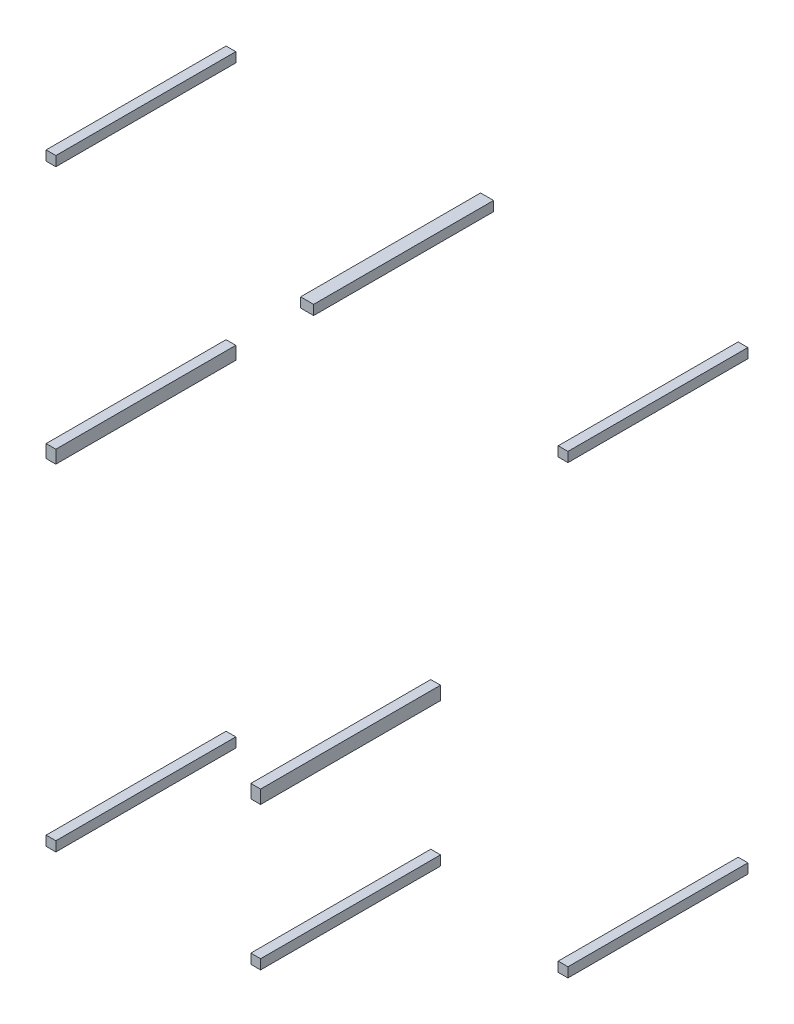
ISO-10303-21;
HEADER;
FILE_DESCRIPTION(('STEP AP214'),'2;1');
FILE_NAME('part.step','',(''),(''),'','','');
FILE_SCHEMA(('AUTOMOTIVE_DESIGN { 1 0 10303 214 1 1 1 1 }'));
ENDSEC;
DATA;
#1=APPLICATION_CONTEXT('core data for automotive mechanical design processes');
#2=APPLICATION_PROTOCOL_DEFINITION('international standard','automotive_design',2000,#1);
#3=PRODUCT_CONTEXT('',#1,'mechanical');
#4=PRODUCT('Part','Part','',(#3));
#5=PRODUCT_RELATED_PRODUCT_CATEGORY('part','',(#4));
#6=PRODUCT_DEFINITION_FORMATION('','',#4);
#7=PRODUCT_DEFINITION_CONTEXT('part definition',#1,'design');
#8=PRODUCT_DEFINITION('design','',#6,#7);
#9=PRODUCT_DEFINITION_SHAPE('','',#8);
#10=(LENGTH_UNIT() NAMED_UNIT(*) SI_UNIT(.MILLI.,.METRE.));
#11=(NAMED_UNIT(*) PLANE_ANGLE_UNIT() SI_UNIT($,.RADIAN.));
#12=(NAMED_UNIT(*) SI_UNIT($,.STERADIAN.) SOLID_ANGLE_UNIT());
#13=UNCERTAINTY_MEASURE_WITH_UNIT(LENGTH_MEASURE(1.E-05),#10,'distance_accuracy_value','');
#14=(GEOMETRIC_REPRESENTATION_CONTEXT(3) GLOBAL_UNCERTAINTY_ASSIGNED_CONTEXT((#13)) GLOBAL_UNIT_ASSIGNED_CONTEXT((#10,
#11,#12)) REPRESENTATION_CONTEXT('',''));
#15=CARTESIAN_POINT('',(0.,0.,0.));
#16=DIRECTION('',(0.,0.,1.));
#17=DIRECTION('',(1.,0.,0.));
#18=AXIS2_PLACEMENT_3D('',#15,#16,#17);
#19=CARTESIAN_POINT('',(0.,0.,0.));
#20=DIRECTION('',(0.,0.,1.));
#21=DIRECTION('',(1.,0.,0.));
#22=AXIS2_PLACEMENT_3D('',#19,#20,#21);
#23=PLANE('',#22);
#24=DIRECTION('',(0.,-1.,0.));
#25=VECTOR('',#24,1.);
#26=CARTESIAN_POINT('',(50.0000000000005,-3962.,0.));
#27=LINE('',#26,#25);
#28=CARTESIAN_POINT('',(50.0000000000005,-3962.,0.));
#29=VERTEX_POINT('',#28);
#30=CARTESIAN_POINT('',(50.0000000000005,-4162.,0.));
#31=VERTEX_POINT('',#30);
#32=EDGE_CURVE('E12',#29,#31,#27,.T.);
#33=ORIENTED_EDGE('',*,*,#32,.F.);
#34=DIRECTION('',(-1.,0.,0.));
#35=VECTOR('',#34,1.);
#36=CARTESIAN_POINT('',(50.0000000000005,-3962.,0.));
#37=LINE('',#36,#35);
#38=CARTESIAN_POINT('',(200.,-3962.,0.));
#39=VERTEX_POINT('',#38);
#40=EDGE_CURVE('E113',#39,#29,#37,.T.);
#41=ORIENTED_EDGE('',*,*,#40,.F.);
#42=DIRECTION('',(0.,1.,0.));
#43=VECTOR('',#42,1.);
#44=CARTESIAN_POINT('',(200.,-3962.,0.));
#45=LINE('',#44,#43);
#46=CARTESIAN_POINT('',(200.,-4162.,0.));
#47=VERTEX_POINT('',#46);
#48=EDGE_CURVE('E116',#47,#39,#45,.T.);
#49=ORIENTED_EDGE('',*,*,#48,.F.);
#50=DIRECTION('',(1.,0.,0.));
#51=VECTOR('',#50,1.);
#52=CARTESIAN_POINT('',(50.0000000000005,-4162.,0.));
#53=LINE('',#52,#51);
#54=EDGE_CURVE('E59',#31,#47,#53,.T.);
#55=ORIENTED_EDGE('',*,*,#54,.F.);
#56=EDGE_LOOP('',(#33,#41,#49,#55));
#57=FACE_BOUND('',#56,.T.);
#58=ADVANCED_FACE('F50',(#57),#23,.F.);
#59=CARTESIAN_POINT('',(50.0000000000005,-3962.,3022.8254304421));
#60=DIRECTION('',(0.,-1.,0.));
#61=DIRECTION('',(0.,0.,-1.));
#62=AXIS2_PLACEMENT_3D('',#59,#60,#61);
#63=PLANE('',#62);
#64=DIRECTION('',(0.,0.,-1.));
#65=VECTOR('',#64,1.);
#66=CARTESIAN_POINT('',(50.0000000000005,-3962.,3022.8254304421));
#67=LINE('',#66,#65);
#68=CARTESIAN_POINT('',(50.0000000000005,-3962.,2768.));
#69=VERTEX_POINT('',#68);
#70=EDGE_CURVE('E111',#69,#29,#67,.T.);
#71=ORIENTED_EDGE('',*,*,#70,.F.);
#72=DIRECTION('',(1.,0.,0.));
#73=VECTOR('',#72,1.);
#74=CARTESIAN_POINT('',(50.0000000000005,-3962.,2768.));
#75=LINE('',#74,#73);
#76=CARTESIAN_POINT('',(200.,-3962.,2768.));
#77=VERTEX_POINT('',#76);
#78=EDGE_CURVE('E104',#69,#77,#75,.T.);
#79=ORIENTED_EDGE('',*,*,#78,.T.);
#80=DIRECTION('',(0.,0.,-1.));
#81=VECTOR('',#80,1.);
#82=CARTESIAN_POINT('',(200.,-3962.,3022.8254304421));
#83=LINE('',#82,#81);
#84=EDGE_CURVE('E100',#77,#39,#83,.T.);
#85=ORIENTED_EDGE('',*,*,#84,.T.);
#86=ORIENTED_EDGE('',*,*,#40,.T.);
#87=EDGE_LOOP('',(#71,#79,#85,#86));
#88=FACE_BOUND('',#87,.T.);
#89=ADVANCED_FACE('F121',(#88),#63,.F.);
#90=CARTESIAN_POINT('',(200.,-3962.,3022.8254304421));
#91=DIRECTION('',(-1.,0.,0.));
#92=DIRECTION('',(0.,-1.,0.));
#93=AXIS2_PLACEMENT_3D('',#90,#91,#92);
#94=PLANE('',#93);
#95=ORIENTED_EDGE('',*,*,#84,.F.);
#96=DIRECTION('',(0.,-1.,0.));
#97=VECTOR('',#96,1.);
#98=CARTESIAN_POINT('',(200.,-3962.,2768.));
#99=LINE('',#98,#97);
#100=CARTESIAN_POINT('',(200.,-4162.,2768.));
#101=VERTEX_POINT('',#100);
#102=EDGE_CURVE('E54',#77,#101,#99,.T.);
#103=ORIENTED_EDGE('',*,*,#102,.T.);
#104=DIRECTION('',(0.,0.,-1.));
#105=VECTOR('',#104,1.);
#106=CARTESIAN_POINT('',(200.,-4162.,3022.8254304421));
#107=LINE('',#106,#105);
#108=EDGE_CURVE('E75',#101,#47,#107,.T.);
#109=ORIENTED_EDGE('',*,*,#108,.T.);
#110=ORIENTED_EDGE('',*,*,#48,.T.);
#111=EDGE_LOOP('',(#95,#103,#109,#110));
#112=FACE_BOUND('',#111,.T.);
#113=ADVANCED_FACE('F102',(#112),#94,.F.);
#114=CARTESIAN_POINT('',(50.0000000000005,-4162.,3022.8254304421));
#115=DIRECTION('',(0.,1.,0.));
#116=DIRECTION('',(0.,0.,1.));
#117=AXIS2_PLACEMENT_3D('',#114,#115,#116);
#118=PLANE('',#117);
#119=ORIENTED_EDGE('',*,*,#108,.F.);
#120=DIRECTION('',(-1.,0.,0.));
#121=VECTOR('',#120,1.);
#122=CARTESIAN_POINT('',(50.0000000000005,-4162.,2768.));
#123=LINE('',#122,#121);
#124=CARTESIAN_POINT('',(50.0000000000005,-4162.,2768.));
#125=VERTEX_POINT('',#124);
#126=EDGE_CURVE('E94',#101,#125,#123,.T.);
#127=ORIENTED_EDGE('',*,*,#126,.T.);
#128=DIRECTION('',(0.,0.,-1.));
#129=VECTOR('',#128,1.);
#130=CARTESIAN_POINT('',(50.0000000000005,-4162.,3022.8254304421));
#131=LINE('',#130,#129);
#132=EDGE_CURVE('E67',#125,#31,#131,.T.);
#133=ORIENTED_EDGE('',*,*,#132,.T.);
#134=ORIENTED_EDGE('',*,*,#54,.T.);
#135=EDGE_LOOP('',(#119,#127,#133,#134));
#136=FACE_BOUND('',#135,.T.);
#137=ADVANCED_FACE('F98',(#136),#118,.F.);
#138=CARTESIAN_POINT('',(50.0000000000005,-3962.,3022.8254304421));
#139=DIRECTION('',(1.,0.,0.));
#140=DIRECTION('',(0.,1.,0.));
#141=AXIS2_PLACEMENT_3D('',#138,#139,#140);
#142=PLANE('',#141);
#143=ORIENTED_EDGE('',*,*,#132,.F.);
#144=DIRECTION('',(0.,1.,0.));
#145=VECTOR('',#144,1.);
#146=CARTESIAN_POINT('',(50.0000000000005,-3962.,2768.));
#147=LINE('',#146,#145);
#148=EDGE_CURVE('E97',#125,#69,#147,.T.);
#149=ORIENTED_EDGE('',*,*,#148,.T.);
#150=ORIENTED_EDGE('',*,*,#70,.T.);
#151=ORIENTED_EDGE('',*,*,#32,.T.);
#152=EDGE_LOOP('',(#143,#149,#150,#151));
#153=FACE_BOUND('',#152,.T.);
#154=ADVANCED_FACE('F120',(#153),#142,.F.);
#155=CARTESIAN_POINT('',(0.,0.,2768.));
#156=DIRECTION('',(0.,0.,-1.));
#157=DIRECTION('',(0.,1.,0.));
#158=AXIS2_PLACEMENT_3D('',#155,#156,#157);
#159=PLANE('',#158);
#160=ORIENTED_EDGE('',*,*,#126,.F.);
#161=ORIENTED_EDGE('',*,*,#102,.F.);
#162=ORIENTED_EDGE('',*,*,#78,.F.);
#163=ORIENTED_EDGE('',*,*,#148,.F.);
#164=EDGE_LOOP('',(#160,#161,#162,#163));
#165=FACE_BOUND('',#164,.T.);
#166=ADVANCED_FACE('F52',(#165),#159,.F.);
#167=CLOSED_SHELL('',(#58,#89,#113,#137,#154,#166));
#168=MANIFOLD_SOLID_BREP('B2',#167);
#169=CARTESIAN_POINT('',(0.,0.,0.));
#170=DIRECTION('',(0.,0.,-1.));
#171=DIRECTION('',(-1.,0.,0.));
#172=AXIS2_PLACEMENT_3D('',#169,#170,#171);
#173=PLANE('',#172);
#174=DIRECTION('',(0.,1.,0.));
#175=VECTOR('',#174,1.);
#176=CARTESIAN_POINT('',(200.,-9178.,0.));
#177=LINE('',#176,#175);
#178=CARTESIAN_POINT('',(200.000000000001,-9328.,0.));
#179=VERTEX_POINT('',#178);
#180=CARTESIAN_POINT('',(200.,-9178.,0.));
#181=VERTEX_POINT('',#180);
#182=EDGE_CURVE('E48',#179,#181,#177,.T.);
#183=ORIENTED_EDGE('',*,*,#182,.F.);
#184=DIRECTION('',(1.,0.,0.));
#185=VECTOR('',#184,1.);
#186=CARTESIAN_POINT('',(200.000000000001,-9328.,0.));
#187=LINE('',#186,#185);
#188=CARTESIAN_POINT('',(50.0000000000005,-9328.,0.));
#189=VERTEX_POINT('',#188);
#190=EDGE_CURVE('E247',#189,#179,#187,.T.);
#191=ORIENTED_EDGE('',*,*,#190,.F.);
#192=DIRECTION('',(0.,-1.,0.));
#193=VECTOR('',#192,1.);
#194=CARTESIAN_POINT('',(50.0000000000005,-9178.,0.));
#195=LINE('',#194,#193);
#196=CARTESIAN_POINT('',(50.0000000000005,-9178.,0.));
#197=VERTEX_POINT('',#196);
#198=EDGE_CURVE('E250',#197,#189,#195,.T.);
#199=ORIENTED_EDGE('',*,*,#198,.F.);
#200=DIRECTION('',(-1.,0.,0.));
#201=VECTOR('',#200,1.);
#202=CARTESIAN_POINT('',(200.,-9178.,0.));
#203=LINE('',#202,#201);
#204=EDGE_CURVE('E193',#181,#197,#203,.T.);
#205=ORIENTED_EDGE('',*,*,#204,.F.);
#206=EDGE_LOOP('',(#183,#191,#199,#205));
#207=FACE_BOUND('',#206,.T.);
#208=ADVANCED_FACE('F184',(#207),#173,.T.);
#209=CARTESIAN_POINT('',(200.000000000001,-9328.,3022.8254304421));
#210=DIRECTION('',(0.,1.,0.));
#211=DIRECTION('',(0.,0.,1.));
#212=AXIS2_PLACEMENT_3D('',#209,#210,#211);
#213=PLANE('',#212);
#214=DIRECTION('',(0.,0.,-1.));
#215=VECTOR('',#214,1.);
#216=CARTESIAN_POINT('',(200.000000000001,-9328.,3022.8254304421));
#217=LINE('',#216,#215);
#218=CARTESIAN_POINT('',(200.000000000001,-9328.,2768.));
#219=VERTEX_POINT('',#218);
#220=EDGE_CURVE('E245',#219,#179,#217,.T.);
#221=ORIENTED_EDGE('',*,*,#220,.F.);
#222=DIRECTION('',(-1.,0.,0.));
#223=VECTOR('',#222,1.);
#224=CARTESIAN_POINT('',(200.000000000001,-9328.,2768.));
#225=LINE('',#224,#223);
#226=CARTESIAN_POINT('',(50.0000000000005,-9328.,2768.));
#227=VERTEX_POINT('',#226);
#228=EDGE_CURVE('E238',#219,#227,#225,.T.);
#229=ORIENTED_EDGE('',*,*,#228,.T.);
#230=DIRECTION('',(0.,0.,-1.));
#231=VECTOR('',#230,1.);
#232=CARTESIAN_POINT('',(50.0000000000005,-9328.,3022.8254304421));
#233=LINE('',#232,#231);
#234=EDGE_CURVE('E234',#227,#189,#233,.T.);
#235=ORIENTED_EDGE('',*,*,#234,.T.);
#236=ORIENTED_EDGE('',*,*,#190,.T.);
#237=EDGE_LOOP('',(#221,#229,#235,#236));
#238=FACE_BOUND('',#237,.T.);
#239=ADVANCED_FACE('F255',(#238),#213,.F.);
#240=CARTESIAN_POINT('',(50.0000000000005,-9178.,3022.8254304421));
#241=DIRECTION('',(1.,0.,0.));
#242=DIRECTION('',(0.,1.,0.));
#243=AXIS2_PLACEMENT_3D('',#240,#241,#242);
#244=PLANE('',#243);
#245=ORIENTED_EDGE('',*,*,#234,.F.);
#246=DIRECTION('',(0.,1.,0.));
#247=VECTOR('',#246,1.);
#248=CARTESIAN_POINT('',(50.0000000000005,-9178.,2768.));
#249=LINE('',#248,#247);
#250=CARTESIAN_POINT('',(50.0000000000005,-9178.,2768.));
#251=VERTEX_POINT('',#250);
#252=EDGE_CURVE('E188',#227,#251,#249,.T.);
#253=ORIENTED_EDGE('',*,*,#252,.T.);
#254=DIRECTION('',(0.,0.,-1.));
#255=VECTOR('',#254,1.);
#256=CARTESIAN_POINT('',(50.0000000000005,-9178.,3022.8254304421));
#257=LINE('',#256,#255);
#258=EDGE_CURVE('E209',#251,#197,#257,.T.);
#259=ORIENTED_EDGE('',*,*,#258,.T.);
#260=ORIENTED_EDGE('',*,*,#198,.T.);
#261=EDGE_LOOP('',(#245,#253,#259,#260));
#262=FACE_BOUND('',#261,.T.);
#263=ADVANCED_FACE('F236',(#262),#244,.F.);
#264=CARTESIAN_POINT('',(200.,-9178.,3022.8254304421));
#265=DIRECTION('',(0.,-1.,0.));
#266=DIRECTION('',(0.,0.,-1.));
#267=AXIS2_PLACEMENT_3D('',#264,#265,#266);
#268=PLANE('',#267);
#269=ORIENTED_EDGE('',*,*,#258,.F.);
#270=DIRECTION('',(1.,0.,0.));
#271=VECTOR('',#270,1.);
#272=CARTESIAN_POINT('',(200.,-9178.,2768.));
#273=LINE('',#272,#271);
#274=CARTESIAN_POINT('',(200.,-9178.,2768.));
#275=VERTEX_POINT('',#274);
#276=EDGE_CURVE('E228',#251,#275,#273,.T.);
#277=ORIENTED_EDGE('',*,*,#276,.T.);
#278=DIRECTION('',(0.,0.,-1.));
#279=VECTOR('',#278,1.);
#280=CARTESIAN_POINT('',(200.,-9178.,3022.8254304421));
#281=LINE('',#280,#279);
#282=EDGE_CURVE('E201',#275,#181,#281,.T.);
#283=ORIENTED_EDGE('',*,*,#282,.T.);
#284=ORIENTED_EDGE('',*,*,#204,.T.);
#285=EDGE_LOOP('',(#269,#277,#283,#284));
#286=FACE_BOUND('',#285,.T.);
#287=ADVANCED_FACE('F232',(#286),#268,.F.);
#288=CARTESIAN_POINT('',(200.,-9178.,3022.8254304421));
#289=DIRECTION('',(-1.,0.,0.));
#290=DIRECTION('',(0.,-1.,0.));
#291=AXIS2_PLACEMENT_3D('',#288,#289,#290);
#292=PLANE('',#291);
#293=ORIENTED_EDGE('',*,*,#282,.F.);
#294=DIRECTION('',(0.,-1.,0.));
#295=VECTOR('',#294,1.);
#296=CARTESIAN_POINT('',(200.,-9178.,2768.));
#297=LINE('',#296,#295);
#298=EDGE_CURVE('E231',#275,#219,#297,.T.);
#299=ORIENTED_EDGE('',*,*,#298,.T.);
#300=ORIENTED_EDGE('',*,*,#220,.T.);
#301=ORIENTED_EDGE('',*,*,#182,.T.);
#302=EDGE_LOOP('',(#293,#299,#300,#301));
#303=FACE_BOUND('',#302,.T.);
#304=ADVANCED_FACE('F254',(#303),#292,.F.);
#305=CARTESIAN_POINT('',(0.,0.,2768.));
#306=DIRECTION('',(0.,0.,-1.));
#307=DIRECTION('',(0.,1.,0.));
#308=AXIS2_PLACEMENT_3D('',#305,#306,#307);
#309=PLANE('',#308);
#310=ORIENTED_EDGE('',*,*,#276,.F.);
#311=ORIENTED_EDGE('',*,*,#252,.F.);
#312=ORIENTED_EDGE('',*,*,#228,.F.);
#313=ORIENTED_EDGE('',*,*,#298,.F.);
#314=EDGE_LOOP('',(#310,#311,#312,#313));
#315=FACE_BOUND('',#314,.T.);
#316=ADVANCED_FACE('F186',(#315),#309,.F.);
#317=CLOSED_SHELL('',(#208,#239,#263,#287,#304,#316));
#318=MANIFOLD_SOLID_BREP('B6',#317);
#319=CARTESIAN_POINT('',(0.,0.,0.));
#320=DIRECTION('',(0.,0.,1.));
#321=DIRECTION('',(1.,0.,0.));
#322=AXIS2_PLACEMENT_3D('',#319,#320,#321);
#323=PLANE('',#322);
#324=DIRECTION('',(0.,-1.,0.));
#325=VECTOR('',#324,1.);
#326=CARTESIAN_POINT('',(7927.,-6917.99999999999,0.));
#327=LINE('',#326,#325);
#328=CARTESIAN_POINT('',(7927.,-6917.99999999999,0.));
#329=VERTEX_POINT('',#328);
#330=CARTESIAN_POINT('',(7927.,-7067.99999999999,0.));
#331=VERTEX_POINT('',#330);
#332=EDGE_CURVE('E182',#329,#331,#327,.T.);
#333=ORIENTED_EDGE('',*,*,#332,.F.);
#334=DIRECTION('',(-1.,0.,0.));
#335=VECTOR('',#334,1.);
#336=CARTESIAN_POINT('',(7927.,-6917.99999999999,0.));
#337=LINE('',#336,#335);
#338=CARTESIAN_POINT('',(8077.,-6917.99999999999,0.));
#339=VERTEX_POINT('',#338);
#340=EDGE_CURVE('E381',#339,#329,#337,.T.);
#341=ORIENTED_EDGE('',*,*,#340,.F.);
#342=DIRECTION('',(0.,1.,0.));
#343=VECTOR('',#342,1.);
#344=CARTESIAN_POINT('',(8077.,-6917.99999999999,0.));
#345=LINE('',#344,#343);
#346=CARTESIAN_POINT('',(8077.,-7067.99999999999,0.));
#347=VERTEX_POINT('',#346);
#348=EDGE_CURVE('E384',#347,#339,#345,.T.);
#349=ORIENTED_EDGE('',*,*,#348,.F.);
#350=DIRECTION('',(1.,0.,0.));
#351=VECTOR('',#350,1.);
#352=CARTESIAN_POINT('',(7927.,-7067.99999999999,0.));
#353=LINE('',#352,#351);
#354=EDGE_CURVE('E327',#331,#347,#353,.T.);
#355=ORIENTED_EDGE('',*,*,#354,.F.);
#356=EDGE_LOOP('',(#333,#341,#349,#355));
#357=FACE_BOUND('',#356,.T.);
#358=ADVANCED_FACE('F318',(#357),#323,.F.);
#359=CARTESIAN_POINT('',(7927.,-6917.99999999999,3022.8254304421));
#360=DIRECTION('',(0.,-1.,0.));
#361=DIRECTION('',(0.,0.,-1.));
#362=AXIS2_PLACEMENT_3D('',#359,#360,#361);
#363=PLANE('',#362);
#364=DIRECTION('',(0.,0.,-1.));
#365=VECTOR('',#364,1.);
#366=CARTESIAN_POINT('',(7927.,-6917.99999999999,3022.8254304421));
#367=LINE('',#366,#365);
#368=CARTESIAN_POINT('',(7927.,-6917.99999999999,2768.));
#369=VERTEX_POINT('',#368);
#370=EDGE_CURVE('E379',#369,#329,#367,.T.);
#371=ORIENTED_EDGE('',*,*,#370,.F.);
#372=DIRECTION('',(1.,0.,0.));
#373=VECTOR('',#372,1.);
#374=CARTESIAN_POINT('',(7927.,-6917.99999999999,2768.));
#375=LINE('',#374,#373);
#376=CARTESIAN_POINT('',(8077.,-6917.99999999999,2768.));
#377=VERTEX_POINT('',#376);
#378=EDGE_CURVE('E372',#369,#377,#375,.T.);
#379=ORIENTED_EDGE('',*,*,#378,.T.);
#380=DIRECTION('',(0.,0.,-1.));
#381=VECTOR('',#380,1.);
#382=CARTESIAN_POINT('',(8077.,-6917.99999999999,3022.8254304421));
#383=LINE('',#382,#381);
#384=EDGE_CURVE('E368',#377,#339,#383,.T.);
#385=ORIENTED_EDGE('',*,*,#384,.T.);
#386=ORIENTED_EDGE('',*,*,#340,.T.);
#387=EDGE_LOOP('',(#371,#379,#385,#386));
#388=FACE_BOUND('',#387,.T.);
#389=ADVANCED_FACE('F389',(#388),#363,.F.);
#390=CARTESIAN_POINT('',(8077.,-6917.99999999999,3022.8254304421));
#391=DIRECTION('',(-1.,0.,0.));
#392=DIRECTION('',(0.,-1.,0.));
#393=AXIS2_PLACEMENT_3D('',#390,#391,#392);
#394=PLANE('',#393);
#395=ORIENTED_EDGE('',*,*,#384,.F.);
#396=DIRECTION('',(0.,-1.,0.));
#397=VECTOR('',#396,1.);
#398=CARTESIAN_POINT('',(8077.,-6917.99999999999,2768.));
#399=LINE('',#398,#397);
#400=CARTESIAN_POINT('',(8077.,-7067.99999999999,2768.));
#401=VERTEX_POINT('',#400);
#402=EDGE_CURVE('E322',#377,#401,#399,.T.);
#403=ORIENTED_EDGE('',*,*,#402,.T.);
#404=DIRECTION('',(0.,0.,-1.));
#405=VECTOR('',#404,1.);
#406=CARTESIAN_POINT('',(8077.,-7067.99999999999,3022.8254304421));
#407=LINE('',#406,#405);
#408=EDGE_CURVE('E343',#401,#347,#407,.T.);
#409=ORIENTED_EDGE('',*,*,#408,.T.);
#410=ORIENTED_EDGE('',*,*,#348,.T.);
#411=EDGE_LOOP('',(#395,#403,#409,#410));
#412=FACE_BOUND('',#411,.T.);
#413=ADVANCED_FACE('F370',(#412),#394,.F.);
#414=CARTESIAN_POINT('',(7927.,-7067.99999999999,3022.8254304421));
#415=DIRECTION('',(0.,1.,0.));
#416=DIRECTION('',(0.,0.,1.));
#417=AXIS2_PLACEMENT_3D('',#414,#415,#416);
#418=PLANE('',#417);
#419=ORIENTED_EDGE('',*,*,#408,.F.);
#420=DIRECTION('',(-1.,0.,0.));
#421=VECTOR('',#420,1.);
#422=CARTESIAN_POINT('',(7927.,-7067.99999999999,2768.));
#423=LINE('',#422,#421);
#424=CARTESIAN_POINT('',(7927.,-7067.99999999999,2768.));
#425=VERTEX_POINT('',#424);
#426=EDGE_CURVE('E362',#401,#425,#423,.T.);
#427=ORIENTED_EDGE('',*,*,#426,.T.);
#428=DIRECTION('',(0.,0.,-1.));
#429=VECTOR('',#428,1.);
#430=CARTESIAN_POINT('',(7927.,-7067.99999999999,3022.8254304421));
#431=LINE('',#430,#429);
#432=EDGE_CURVE('E335',#425,#331,#431,.T.);
#433=ORIENTED_EDGE('',*,*,#432,.T.);
#434=ORIENTED_EDGE('',*,*,#354,.T.);
#435=EDGE_LOOP('',(#419,#427,#433,#434));
#436=FACE_BOUND('',#435,.T.);
#437=ADVANCED_FACE('F366',(#436),#418,.F.);
#438=CARTESIAN_POINT('',(7927.,-6917.99999999999,3022.8254304421));
#439=DIRECTION('',(1.,0.,0.));
#440=DIRECTION('',(0.,1.,0.));
#441=AXIS2_PLACEMENT_3D('',#438,#439,#440);
#442=PLANE('',#441);
#443=ORIENTED_EDGE('',*,*,#432,.F.);
#444=DIRECTION('',(0.,1.,0.));
#445=VECTOR('',#444,1.);
#446=CARTESIAN_POINT('',(7927.,-6917.99999999999,2768.));
#447=LINE('',#446,#445);
#448=EDGE_CURVE('E365',#425,#369,#447,.T.);
#449=ORIENTED_EDGE('',*,*,#448,.T.);
#450=ORIENTED_EDGE('',*,*,#370,.T.);
#451=ORIENTED_EDGE('',*,*,#332,.T.);
#452=EDGE_LOOP('',(#443,#449,#450,#451));
#453=FACE_BOUND('',#452,.T.);
#454=ADVANCED_FACE('F388',(#453),#442,.F.);
#455=CARTESIAN_POINT('',(0.,0.,2768.));
#456=DIRECTION('',(0.,0.,-1.));
#457=DIRECTION('',(0.,1.,0.));
#458=AXIS2_PLACEMENT_3D('',#455,#456,#457);
#459=PLANE('',#458);
#460=ORIENTED_EDGE('',*,*,#426,.F.);
#461=ORIENTED_EDGE('',*,*,#402,.F.);
#462=ORIENTED_EDGE('',*,*,#378,.F.);
#463=ORIENTED_EDGE('',*,*,#448,.F.);
#464=EDGE_LOOP('',(#460,#461,#462,#463));
#465=FACE_BOUND('',#464,.T.);
#466=ADVANCED_FACE('F320',(#465),#459,.F.);
#467=CLOSED_SHELL('',(#358,#389,#413,#437,#454,#466));
#468=MANIFOLD_SOLID_BREP('B42',#467);
#469=CARTESIAN_POINT('',(0.,0.,0.));
#470=DIRECTION('',(0.,0.,1.));
#471=DIRECTION('',(1.,0.,0.));
#472=AXIS2_PLACEMENT_3D('',#469,#470,#471);
#473=PLANE('',#472);
#474=DIRECTION('',(0.,-1.,0.));
#475=VECTOR('',#474,1.);
#476=CARTESIAN_POINT('',(3199.,-9175.,0.));
#477=LINE('',#476,#475);
#478=CARTESIAN_POINT('',(3199.,-9175.,0.));
#479=VERTEX_POINT('',#478);
#480=CARTESIAN_POINT('',(3199.,-9325.,0.));
#481=VERTEX_POINT('',#480);
#482=EDGE_CURVE('E316',#479,#481,#477,.T.);
#483=ORIENTED_EDGE('',*,*,#482,.F.);
#484=DIRECTION('',(-1.,0.,0.));
#485=VECTOR('',#484,1.);
#486=CARTESIAN_POINT('',(3199.,-9175.,0.));
#487=LINE('',#486,#485);
#488=CARTESIAN_POINT('',(3349.,-9175.,0.));
#489=VERTEX_POINT('',#488);
#490=EDGE_CURVE('E515',#489,#479,#487,.T.);
#491=ORIENTED_EDGE('',*,*,#490,.F.);
#492=DIRECTION('',(0.,1.,0.));
#493=VECTOR('',#492,1.);
#494=CARTESIAN_POINT('',(3349.,-9175.,0.));
#495=LINE('',#494,#493);
#496=CARTESIAN_POINT('',(3349.,-9325.,0.));
#497=VERTEX_POINT('',#496);
#498=EDGE_CURVE('E518',#497,#489,#495,.T.);
#499=ORIENTED_EDGE('',*,*,#498,.F.);
#500=DIRECTION('',(1.,0.,0.));
#501=VECTOR('',#500,1.);
#502=CARTESIAN_POINT('',(3199.,-9325.,0.));
#503=LINE('',#502,#501);
#504=EDGE_CURVE('E461',#481,#497,#503,.T.);
#505=ORIENTED_EDGE('',*,*,#504,.F.);
#506=EDGE_LOOP('',(#483,#491,#499,#505));
#507=FACE_BOUND('',#506,.T.);
#508=ADVANCED_FACE('F452',(#507),#473,.F.);
#509=CARTESIAN_POINT('',(3199.,-9175.,3022.8254304421));
#510=DIRECTION('',(0.,-1.,0.));
#511=DIRECTION('',(0.,0.,-1.));
#512=AXIS2_PLACEMENT_3D('',#509,#510,#511);
#513=PLANE('',#512);
#514=DIRECTION('',(0.,0.,-1.));
#515=VECTOR('',#514,1.);
#516=CARTESIAN_POINT('',(3199.,-9175.,3022.8254304421));
#517=LINE('',#516,#515);
#518=CARTESIAN_POINT('',(3199.,-9175.,2768.));
#519=VERTEX_POINT('',#518);
#520=EDGE_CURVE('E513',#519,#479,#517,.T.);
#521=ORIENTED_EDGE('',*,*,#520,.F.);
#522=DIRECTION('',(1.,0.,0.));
#523=VECTOR('',#522,1.);
#524=CARTESIAN_POINT('',(3199.,-9175.,2768.));
#525=LINE('',#524,#523);
#526=CARTESIAN_POINT('',(3349.,-9175.,2768.));
#527=VERTEX_POINT('',#526);
#528=EDGE_CURVE('E506',#519,#527,#525,.T.);
#529=ORIENTED_EDGE('',*,*,#528,.T.);
#530=DIRECTION('',(0.,0.,-1.));
#531=VECTOR('',#530,1.);
#532=CARTESIAN_POINT('',(3349.,-9175.,3022.8254304421));
#533=LINE('',#532,#531);
#534=EDGE_CURVE('E502',#527,#489,#533,.T.);
#535=ORIENTED_EDGE('',*,*,#534,.T.);
#536=ORIENTED_EDGE('',*,*,#490,.T.);
#537=EDGE_LOOP('',(#521,#529,#535,#536));
#538=FACE_BOUND('',#537,.T.);
#539=ADVANCED_FACE('F523',(#538),#513,.F.);
#540=CARTESIAN_POINT('',(3349.,-9175.,3022.8254304421));
#541=DIRECTION('',(-1.,0.,0.));
#542=DIRECTION('',(0.,0.,1.));
#543=AXIS2_PLACEMENT_3D('',#540,#541,#542);
#544=PLANE('',#543);
#545=ORIENTED_EDGE('',*,*,#534,.F.);
#546=DIRECTION('',(0.,-1.,0.));
#547=VECTOR('',#546,1.);
#548=CARTESIAN_POINT('',(3349.,-9175.,2768.));
#549=LINE('',#548,#547);
#550=CARTESIAN_POINT('',(3349.,-9325.,2768.));
#551=VERTEX_POINT('',#550);
#552=EDGE_CURVE('E456',#527,#551,#549,.T.);
#553=ORIENTED_EDGE('',*,*,#552,.T.);
#554=DIRECTION('',(0.,0.,-1.));
#555=VECTOR('',#554,1.);
#556=CARTESIAN_POINT('',(3349.,-9325.,3022.8254304421));
#557=LINE('',#556,#555);
#558=EDGE_CURVE('E477',#551,#497,#557,.T.);
#559=ORIENTED_EDGE('',*,*,#558,.T.);
#560=ORIENTED_EDGE('',*,*,#498,.T.);
#561=EDGE_LOOP('',(#545,#553,#559,#560));
#562=FACE_BOUND('',#561,.T.);
#563=ADVANCED_FACE('F504',(#562),#544,.F.);
#564=CARTESIAN_POINT('',(3199.,-9325.,3022.8254304421));
#565=DIRECTION('',(0.,1.,0.));
#566=DIRECTION('',(0.,0.,1.));
#567=AXIS2_PLACEMENT_3D('',#564,#565,#566);
#568=PLANE('',#567);
#569=ORIENTED_EDGE('',*,*,#558,.F.);
#570=DIRECTION('',(-1.,0.,0.));
#571=VECTOR('',#570,1.);
#572=CARTESIAN_POINT('',(3199.,-9325.,2768.));
#573=LINE('',#572,#571);
#574=CARTESIAN_POINT('',(3199.,-9325.,2768.));
#575=VERTEX_POINT('',#574);
#576=EDGE_CURVE('E496',#551,#575,#573,.T.);
#577=ORIENTED_EDGE('',*,*,#576,.T.);
#578=DIRECTION('',(0.,0.,-1.));
#579=VECTOR('',#578,1.);
#580=CARTESIAN_POINT('',(3199.,-9325.,3022.8254304421));
#581=LINE('',#580,#579);
#582=EDGE_CURVE('E469',#575,#481,#581,.T.);
#583=ORIENTED_EDGE('',*,*,#582,.T.);
#584=ORIENTED_EDGE('',*,*,#504,.T.);
#585=EDGE_LOOP('',(#569,#577,#583,#584));
#586=FACE_BOUND('',#585,.T.);
#587=ADVANCED_FACE('F500',(#586),#568,.F.);
#588=CARTESIAN_POINT('',(3199.,-9175.,3022.8254304421));
#589=DIRECTION('',(1.,0.,0.));
#590=DIRECTION('',(0.,0.,-1.));
#591=AXIS2_PLACEMENT_3D('',#588,#589,#590);
#592=PLANE('',#591);
#593=ORIENTED_EDGE('',*,*,#582,.F.);
#594=DIRECTION('',(0.,1.,0.));
#595=VECTOR('',#594,1.);
#596=CARTESIAN_POINT('',(3199.,-9175.,2768.));
#597=LINE('',#596,#595);
#598=EDGE_CURVE('E499',#575,#519,#597,.T.);
#599=ORIENTED_EDGE('',*,*,#598,.T.);
#600=ORIENTED_EDGE('',*,*,#520,.T.);
#601=ORIENTED_EDGE('',*,*,#482,.T.);
#602=EDGE_LOOP('',(#593,#599,#600,#601));
#603=FACE_BOUND('',#602,.T.);
#604=ADVANCED_FACE('F522',(#603),#592,.F.);
#605=CARTESIAN_POINT('',(0.,0.,2768.));
#606=DIRECTION('',(0.,0.,-1.));
#607=DIRECTION('',(0.,1.,0.));
#608=AXIS2_PLACEMENT_3D('',#605,#606,#607);
#609=PLANE('',#608);
#610=ORIENTED_EDGE('',*,*,#576,.F.);
#611=ORIENTED_EDGE('',*,*,#552,.F.);
#612=ORIENTED_EDGE('',*,*,#528,.F.);
#613=ORIENTED_EDGE('',*,*,#598,.F.);
#614=EDGE_LOOP('',(#610,#611,#612,#613));
#615=FACE_BOUND('',#614,.T.);
#616=ADVANCED_FACE('F454',(#615),#609,.F.);
#617=CLOSED_SHELL('',(#508,#539,#563,#587,#604,#616));
#618=MANIFOLD_SOLID_BREP('B176',#617);
#619=CARTESIAN_POINT('',(0.,0.,0.));
#620=DIRECTION('',(0.,0.,1.));
#621=DIRECTION('',(1.,0.,0.));
#622=AXIS2_PLACEMENT_3D('',#619,#620,#621);
#623=PLANE('',#622);
#624=DIRECTION('',(0.,-1.,0.));
#625=VECTOR('',#624,1.);
#626=CARTESIAN_POINT('',(3199.,-6914.99999999999,0.));
#627=LINE('',#626,#625);
#628=CARTESIAN_POINT('',(3199.,-6914.99999999999,0.));
#629=VERTEX_POINT('',#628);
#630=CARTESIAN_POINT('',(3199.,-7120.99999999999,0.));
#631=VERTEX_POINT('',#630);
#632=EDGE_CURVE('E450',#629,#631,#627,.T.);
#633=ORIENTED_EDGE('',*,*,#632,.F.);
#634=DIRECTION('',(-1.,0.,0.));
#635=VECTOR('',#634,1.);
#636=CARTESIAN_POINT('',(3199.,-6914.99999999999,0.));
#637=LINE('',#636,#635);
#638=CARTESIAN_POINT('',(3349.,-6914.99999999999,0.));
#639=VERTEX_POINT('',#638);
#640=EDGE_CURVE('E649',#639,#629,#637,.T.);
#641=ORIENTED_EDGE('',*,*,#640,.F.);
#642=DIRECTION('',(0.,1.,0.));
#643=VECTOR('',#642,1.);
#644=CARTESIAN_POINT('',(3349.,-6914.99999999999,0.));
#645=LINE('',#644,#643);
#646=CARTESIAN_POINT('',(3349.,-7120.99999999999,0.));
#647=VERTEX_POINT('',#646);
#648=EDGE_CURVE('E652',#647,#639,#645,.T.);
#649=ORIENTED_EDGE('',*,*,#648,.F.);
#650=DIRECTION('',(1.,0.,0.));
#651=VECTOR('',#650,1.);
#652=CARTESIAN_POINT('',(3199.,-7120.99999999999,0.));
#653=LINE('',#652,#651);
#654=EDGE_CURVE('E595',#631,#647,#653,.T.);
#655=ORIENTED_EDGE('',*,*,#654,.F.);
#656=EDGE_LOOP('',(#633,#641,#649,#655));
#657=FACE_BOUND('',#656,.T.);
#658=ADVANCED_FACE('F586',(#657),#623,.F.);
#659=CARTESIAN_POINT('',(3199.,-6914.99999999999,3022.8254304421));
#660=DIRECTION('',(0.,-1.,0.));
#661=DIRECTION('',(0.,0.,-1.));
#662=AXIS2_PLACEMENT_3D('',#659,#660,#661);
#663=PLANE('',#662);
#664=DIRECTION('',(0.,0.,-1.));
#665=VECTOR('',#664,1.);
#666=CARTESIAN_POINT('',(3199.,-6914.99999999999,3022.8254304421));
#667=LINE('',#666,#665);
#668=CARTESIAN_POINT('',(3199.,-6914.99999999999,2768.));
#669=VERTEX_POINT('',#668);
#670=EDGE_CURVE('E647',#669,#629,#667,.T.);
#671=ORIENTED_EDGE('',*,*,#670,.F.);
#672=DIRECTION('',(1.,0.,0.));
#673=VECTOR('',#672,1.);
#674=CARTESIAN_POINT('',(3199.,-6914.99999999999,2768.));
#675=LINE('',#674,#673);
#676=CARTESIAN_POINT('',(3349.,-6914.99999999999,2768.));
#677=VERTEX_POINT('',#676);
#678=EDGE_CURVE('E640',#669,#677,#675,.T.);
#679=ORIENTED_EDGE('',*,*,#678,.T.);
#680=DIRECTION('',(0.,0.,-1.));
#681=VECTOR('',#680,1.);
#682=CARTESIAN_POINT('',(3349.,-6914.99999999999,3022.8254304421));
#683=LINE('',#682,#681);
#684=EDGE_CURVE('E636',#677,#639,#683,.T.);
#685=ORIENTED_EDGE('',*,*,#684,.T.);
#686=ORIENTED_EDGE('',*,*,#640,.T.);
#687=EDGE_LOOP('',(#671,#679,#685,#686));
#688=FACE_BOUND('',#687,.T.);
#689=ADVANCED_FACE('F657',(#688),#663,.F.);
#690=CARTESIAN_POINT('',(3349.,-6914.99999999999,3022.8254304421));
#691=DIRECTION('',(-1.,0.,0.));
#692=DIRECTION('',(0.,0.,1.));
#693=AXIS2_PLACEMENT_3D('',#690,#691,#692);
#694=PLANE('',#693);
#695=ORIENTED_EDGE('',*,*,#684,.F.);
#696=DIRECTION('',(0.,-1.,0.));
#697=VECTOR('',#696,1.);
#698=CARTESIAN_POINT('',(3349.,-6914.99999999999,2768.));
#699=LINE('',#698,#697);
#700=CARTESIAN_POINT('',(3349.,-7120.99999999999,2768.));
#701=VERTEX_POINT('',#700);
#702=EDGE_CURVE('E590',#677,#701,#699,.T.);
#703=ORIENTED_EDGE('',*,*,#702,.T.);
#704=DIRECTION('',(0.,0.,-1.));
#705=VECTOR('',#704,1.);
#706=CARTESIAN_POINT('',(3349.,-7120.99999999999,3022.8254304421));
#707=LINE('',#706,#705);
#708=EDGE_CURVE('E611',#701,#647,#707,.T.);
#709=ORIENTED_EDGE('',*,*,#708,.T.);
#710=ORIENTED_EDGE('',*,*,#648,.T.);
#711=EDGE_LOOP('',(#695,#703,#709,#710));
#712=FACE_BOUND('',#711,.T.);
#713=ADVANCED_FACE('F638',(#712),#694,.F.);
#714=CARTESIAN_POINT('',(3199.,-7120.99999999999,3022.8254304421));
#715=DIRECTION('',(0.,1.,0.));
#716=DIRECTION('',(0.,0.,1.));
#717=AXIS2_PLACEMENT_3D('',#714,#715,#716);
#718=PLANE('',#717);
#719=ORIENTED_EDGE('',*,*,#708,.F.);
#720=DIRECTION('',(-1.,0.,0.));
#721=VECTOR('',#720,1.);
#722=CARTESIAN_POINT('',(3199.,-7120.99999999999,2768.));
#723=LINE('',#722,#721);
#724=CARTESIAN_POINT('',(3199.,-7120.99999999999,2768.));
#725=VERTEX_POINT('',#724);
#726=EDGE_CURVE('E630',#701,#725,#723,.T.);
#727=ORIENTED_EDGE('',*,*,#726,.T.);
#728=DIRECTION('',(0.,0.,-1.));
#729=VECTOR('',#728,1.);
#730=CARTESIAN_POINT('',(3199.,-7120.99999999999,3022.8254304421));
#731=LINE('',#730,#729);
#732=EDGE_CURVE('E603',#725,#631,#731,.T.);
#733=ORIENTED_EDGE('',*,*,#732,.T.);
#734=ORIENTED_EDGE('',*,*,#654,.T.);
#735=EDGE_LOOP('',(#719,#727,#733,#734));
#736=FACE_BOUND('',#735,.T.);
#737=ADVANCED_FACE('F634',(#736),#718,.F.);
#738=CARTESIAN_POINT('',(3199.,-6914.99999999999,3022.8254304421));
#739=DIRECTION('',(1.,0.,0.));
#740=DIRECTION('',(0.,0.,-1.));
#741=AXIS2_PLACEMENT_3D('',#738,#739,#740);
#742=PLANE('',#741);
#743=ORIENTED_EDGE('',*,*,#732,.F.);
#744=DIRECTION('',(0.,1.,0.));
#745=VECTOR('',#744,1.);
#746=CARTESIAN_POINT('',(3199.,-6914.99999999999,2768.));
#747=LINE('',#746,#745);
#748=EDGE_CURVE('E633',#725,#669,#747,.T.);
#749=ORIENTED_EDGE('',*,*,#748,.T.);
#750=ORIENTED_EDGE('',*,*,#670,.T.);
#751=ORIENTED_EDGE('',*,*,#632,.T.);
#752=EDGE_LOOP('',(#743,#749,#750,#751));
#753=FACE_BOUND('',#752,.T.);
#754=ADVANCED_FACE('F656',(#753),#742,.F.);
#755=CARTESIAN_POINT('',(0.,0.,2768.));
#756=DIRECTION('',(0.,0.,-1.));
#757=DIRECTION('',(0.,1.,0.));
#758=AXIS2_PLACEMENT_3D('',#755,#756,#757);
#759=PLANE('',#758);
#760=ORIENTED_EDGE('',*,*,#726,.F.);
#761=ORIENTED_EDGE('',*,*,#702,.F.);
#762=ORIENTED_EDGE('',*,*,#678,.F.);
#763=ORIENTED_EDGE('',*,*,#748,.F.);
#764=EDGE_LOOP('',(#760,#761,#762,#763));
#765=FACE_BOUND('',#764,.T.);
#766=ADVANCED_FACE('F588',(#765),#759,.F.);
#767=CLOSED_SHELL('',(#658,#689,#713,#737,#754,#766));
#768=MANIFOLD_SOLID_BREP('B310',#767);
#769=CARTESIAN_POINT('',(0.,0.,0.));
#770=DIRECTION('',(0.,0.,-1.));
#771=DIRECTION('',(-1.,0.,0.));
#772=AXIS2_PLACEMENT_3D('',#769,#770,#771);
#773=PLANE('',#772);
#774=DIRECTION('',(0.,-1.,0.));
#775=VECTOR('',#774,1.);
#776=CARTESIAN_POINT('',(7927.,-203.00000000003,0.));
#777=LINE('',#776,#775);
#778=CARTESIAN_POINT('',(7927.,-53.0000000000301,0.));
#779=VERTEX_POINT('',#778);
#780=CARTESIAN_POINT('',(7927.,-203.00000000003,0.));
#781=VERTEX_POINT('',#780);
#782=EDGE_CURVE('E584',#779,#781,#777,.T.);
#783=ORIENTED_EDGE('',*,*,#782,.F.);
#784=DIRECTION('',(-1.,0.,0.));
#785=VECTOR('',#784,1.);
#786=CARTESIAN_POINT('',(7927.,-53.0000000000301,0.));
#787=LINE('',#786,#785);
#788=CARTESIAN_POINT('',(8077.,-53.0000000000301,0.));
#789=VERTEX_POINT('',#788);
#790=EDGE_CURVE('E783',#789,#779,#787,.T.);
#791=ORIENTED_EDGE('',*,*,#790,.F.);
#792=DIRECTION('',(0.,1.,0.));
#793=VECTOR('',#792,1.);
#794=CARTESIAN_POINT('',(8077.,-203.00000000003,0.));
#795=LINE('',#794,#793);
#796=CARTESIAN_POINT('',(8077.,-203.00000000003,0.));
#797=VERTEX_POINT('',#796);
#798=EDGE_CURVE('E786',#797,#789,#795,.T.);
#799=ORIENTED_EDGE('',*,*,#798,.F.);
#800=DIRECTION('',(1.,0.,0.));
#801=VECTOR('',#800,1.);
#802=CARTESIAN_POINT('',(7927.,-203.00000000003,0.));
#803=LINE('',#802,#801);
#804=EDGE_CURVE('E729',#781,#797,#803,.T.);
#805=ORIENTED_EDGE('',*,*,#804,.F.);
#806=EDGE_LOOP('',(#783,#791,#799,#805));
#807=FACE_BOUND('',#806,.T.);
#808=ADVANCED_FACE('F720',(#807),#773,.T.);
#809=CARTESIAN_POINT('',(7927.,-53.0000000000301,3022.8254304421));
#810=DIRECTION('',(0.,-1.,0.));
#811=DIRECTION('',(0.,0.,-1.));
#812=AXIS2_PLACEMENT_3D('',#809,#810,#811);
#813=PLANE('',#812);
#814=DIRECTION('',(0.,0.,-1.));
#815=VECTOR('',#814,1.);
#816=CARTESIAN_POINT('',(7927.,-53.0000000000301,3022.8254304421));
#817=LINE('',#816,#815);
#818=CARTESIAN_POINT('',(7927.,-53.0000000000301,2768.));
#819=VERTEX_POINT('',#818);
#820=EDGE_CURVE('E781',#819,#779,#817,.T.);
#821=ORIENTED_EDGE('',*,*,#820,.F.);
#822=DIRECTION('',(1.,0.,0.));
#823=VECTOR('',#822,1.);
#824=CARTESIAN_POINT('',(7927.,-53.0000000000301,2768.));
#825=LINE('',#824,#823);
#826=CARTESIAN_POINT('',(8077.,-53.0000000000301,2768.));
#827=VERTEX_POINT('',#826);
#828=EDGE_CURVE('E774',#819,#827,#825,.T.);
#829=ORIENTED_EDGE('',*,*,#828,.T.);
#830=DIRECTION('',(0.,0.,-1.));
#831=VECTOR('',#830,1.);
#832=CARTESIAN_POINT('',(8077.,-53.0000000000301,3022.8254304421));
#833=LINE('',#832,#831);
#834=EDGE_CURVE('E770',#827,#789,#833,.T.);
#835=ORIENTED_EDGE('',*,*,#834,.T.);
#836=ORIENTED_EDGE('',*,*,#790,.T.);
#837=EDGE_LOOP('',(#821,#829,#835,#836));
#838=FACE_BOUND('',#837,.T.);
#839=ADVANCED_FACE('F791',(#838),#813,.F.);
#840=CARTESIAN_POINT('',(8077.,-203.00000000003,3022.8254304421));
#841=DIRECTION('',(-1.,0.,0.));
#842=DIRECTION('',(0.,0.,1.));
#843=AXIS2_PLACEMENT_3D('',#840,#841,#842);
#844=PLANE('',#843);
#845=ORIENTED_EDGE('',*,*,#834,.F.);
#846=DIRECTION('',(0.,-1.,0.));
#847=VECTOR('',#846,1.);
#848=CARTESIAN_POINT('',(8077.,-203.00000000003,2768.));
#849=LINE('',#848,#847);
#850=CARTESIAN_POINT('',(8077.,-203.00000000003,2768.));
#851=VERTEX_POINT('',#850);
#852=EDGE_CURVE('E724',#827,#851,#849,.T.);
#853=ORIENTED_EDGE('',*,*,#852,.T.);
#854=DIRECTION('',(0.,0.,-1.));
#855=VECTOR('',#854,1.);
#856=CARTESIAN_POINT('',(8077.,-203.00000000003,3022.8254304421));
#857=LINE('',#856,#855);
#858=EDGE_CURVE('E745',#851,#797,#857,.T.);
#859=ORIENTED_EDGE('',*,*,#858,.T.);
#860=ORIENTED_EDGE('',*,*,#798,.T.);
#861=EDGE_LOOP('',(#845,#853,#859,#860));
#862=FACE_BOUND('',#861,.T.);
#863=ADVANCED_FACE('F772',(#862),#844,.F.);
#864=CARTESIAN_POINT('',(7927.,-203.00000000003,3022.8254304421));
#865=DIRECTION('',(0.,1.,0.));
#866=DIRECTION('',(0.,0.,1.));
#867=AXIS2_PLACEMENT_3D('',#864,#865,#866);
#868=PLANE('',#867);
#869=ORIENTED_EDGE('',*,*,#858,.F.);
#870=DIRECTION('',(-1.,0.,0.));
#871=VECTOR('',#870,1.);
#872=CARTESIAN_POINT('',(7927.,-203.00000000003,2768.));
#873=LINE('',#872,#871);
#874=CARTESIAN_POINT('',(7927.,-203.00000000003,2768.));
#875=VERTEX_POINT('',#874);
#876=EDGE_CURVE('E764',#851,#875,#873,.T.);
#877=ORIENTED_EDGE('',*,*,#876,.T.);
#878=DIRECTION('',(0.,0.,-1.));
#879=VECTOR('',#878,1.);
#880=CARTESIAN_POINT('',(7927.,-203.00000000003,3022.8254304421));
#881=LINE('',#880,#879);
#882=EDGE_CURVE('E737',#875,#781,#881,.T.);
#883=ORIENTED_EDGE('',*,*,#882,.T.);
#884=ORIENTED_EDGE('',*,*,#804,.T.);
#885=EDGE_LOOP('',(#869,#877,#883,#884));
#886=FACE_BOUND('',#885,.T.);
#887=ADVANCED_FACE('F768',(#886),#868,.F.);
#888=CARTESIAN_POINT('',(7927.,-203.00000000003,3022.8254304421));
#889=DIRECTION('',(1.,0.,0.));
#890=DIRECTION('',(0.,0.,-1.));
#891=AXIS2_PLACEMENT_3D('',#888,#889,#890);
#892=PLANE('',#891);
#893=ORIENTED_EDGE('',*,*,#882,.F.);
#894=DIRECTION('',(0.,1.,0.));
#895=VECTOR('',#894,1.);
#896=CARTESIAN_POINT('',(7927.,-203.00000000003,2768.));
#897=LINE('',#896,#895);
#898=EDGE_CURVE('E767',#875,#819,#897,.T.);
#899=ORIENTED_EDGE('',*,*,#898,.T.);
#900=ORIENTED_EDGE('',*,*,#820,.T.);
#901=ORIENTED_EDGE('',*,*,#782,.T.);
#902=EDGE_LOOP('',(#893,#899,#900,#901));
#903=FACE_BOUND('',#902,.T.);
#904=ADVANCED_FACE('F790',(#903),#892,.F.);
#905=CARTESIAN_POINT('',(0.,0.,2768.));
#906=DIRECTION('',(0.,0.,-1.));
#907=DIRECTION('',(0.,1.,0.));
#908=AXIS2_PLACEMENT_3D('',#905,#906,#907);
#909=PLANE('',#908);
#910=ORIENTED_EDGE('',*,*,#876,.F.);
#911=ORIENTED_EDGE('',*,*,#852,.F.);
#912=ORIENTED_EDGE('',*,*,#828,.F.);
#913=ORIENTED_EDGE('',*,*,#898,.F.);
#914=EDGE_LOOP('',(#910,#911,#912,#913));
#915=FACE_BOUND('',#914,.T.);
#916=ADVANCED_FACE('F722',(#915),#909,.F.);
#917=CLOSED_SHELL('',(#808,#839,#863,#887,#904,#916));
#918=MANIFOLD_SOLID_BREP('B444',#917);
#919=CARTESIAN_POINT('',(0.,0.,0.));
#920=DIRECTION('',(0.,0.,-1.));
#921=DIRECTION('',(-1.,0.,0.));
#922=AXIS2_PLACEMENT_3D('',#919,#920,#921);
#923=PLANE('',#922);
#924=DIRECTION('',(0.,-1.,0.));
#925=VECTOR('',#924,1.);
#926=CARTESIAN_POINT('',(3965.,-200.,0.));
#927=LINE('',#926,#925);
#928=CARTESIAN_POINT('',(3965.,-50.,0.));
#929=VERTEX_POINT('',#928);
#930=CARTESIAN_POINT('',(3965.,-200.,0.));
#931=VERTEX_POINT('',#930);
#932=EDGE_CURVE('E718',#929,#931,#927,.T.);
#933=ORIENTED_EDGE('',*,*,#932,.F.);
#934=DIRECTION('',(-1.,0.,0.));
#935=VECTOR('',#934,1.);
#936=CARTESIAN_POINT('',(3965.,-50.,0.));
#937=LINE('',#936,#935);
#938=CARTESIAN_POINT('',(4165.,-50.,0.));
#939=VERTEX_POINT('',#938);
#940=EDGE_CURVE('E916',#939,#929,#937,.T.);
#941=ORIENTED_EDGE('',*,*,#940,.F.);
#942=DIRECTION('',(0.,1.,0.));
#943=VECTOR('',#942,1.);
#944=CARTESIAN_POINT('',(4165.,-200.,0.));
#945=LINE('',#944,#943);
#946=CARTESIAN_POINT('',(4165.,-200.,0.));
#947=VERTEX_POINT('',#946);
#948=EDGE_CURVE('E919',#947,#939,#945,.T.);
#949=ORIENTED_EDGE('',*,*,#948,.F.);
#950=DIRECTION('',(1.,0.,0.));
#951=VECTOR('',#950,1.);
#952=CARTESIAN_POINT('',(3965.,-200.,0.));
#953=LINE('',#952,#951);
#954=EDGE_CURVE('E862',#931,#947,#953,.T.);
#955=ORIENTED_EDGE('',*,*,#954,.F.);
#956=EDGE_LOOP('',(#933,#941,#949,#955));
#957=FACE_BOUND('',#956,.T.);
#958=ADVANCED_FACE('F853',(#957),#923,.T.);
#959=CARTESIAN_POINT('',(3965.,-50.,3022.8254304421));
#960=DIRECTION('',(0.,-1.,0.));
#961=DIRECTION('',(0.,0.,-1.));
#962=AXIS2_PLACEMENT_3D('',#959,#960,#961);
#963=PLANE('',#962);
#964=DIRECTION('',(0.,0.,-1.));
#965=VECTOR('',#964,1.);
#966=CARTESIAN_POINT('',(3965.,-50.,3022.8254304421));
#967=LINE('',#966,#965);
#968=CARTESIAN_POINT('',(3965.,-50.,2768.));
#969=VERTEX_POINT('',#968);
#970=EDGE_CURVE('E914',#969,#929,#967,.T.);
#971=ORIENTED_EDGE('',*,*,#970,.F.);
#972=DIRECTION('',(1.,0.,0.));
#973=VECTOR('',#972,1.);
#974=CARTESIAN_POINT('',(3965.,-50.,2768.));
#975=LINE('',#974,#973);
#976=CARTESIAN_POINT('',(4165.,-50.,2768.));
#977=VERTEX_POINT('',#976);
#978=EDGE_CURVE('E907',#969,#977,#975,.T.);
#979=ORIENTED_EDGE('',*,*,#978,.T.);
#980=DIRECTION('',(0.,0.,-1.));
#981=VECTOR('',#980,1.);
#982=CARTESIAN_POINT('',(4165.,-50.,3022.8254304421));
#983=LINE('',#982,#981);
#984=EDGE_CURVE('E903',#977,#939,#983,.T.);
#985=ORIENTED_EDGE('',*,*,#984,.T.);
#986=ORIENTED_EDGE('',*,*,#940,.T.);
#987=EDGE_LOOP('',(#971,#979,#985,#986));
#988=FACE_BOUND('',#987,.T.);
#989=ADVANCED_FACE('F924',(#988),#963,.F.);
#990=CARTESIAN_POINT('',(4165.,-200.,3022.8254304421));
#991=DIRECTION('',(-1.,0.,0.));
#992=DIRECTION('',(0.,0.,1.));
#993=AXIS2_PLACEMENT_3D('',#990,#991,#992);
#994=PLANE('',#993);
#995=ORIENTED_EDGE('',*,*,#984,.F.);
#996=DIRECTION('',(0.,-1.,0.));
#997=VECTOR('',#996,1.);
#998=CARTESIAN_POINT('',(4165.,-200.,2768.));
#999=LINE('',#998,#997);
#1000=CARTESIAN_POINT('',(4165.,-200.,2768.));
#1001=VERTEX_POINT('',#1000);
#1002=EDGE_CURVE('E857',#977,#1001,#999,.T.);
#1003=ORIENTED_EDGE('',*,*,#1002,.T.);
#1004=DIRECTION('',(0.,0.,-1.));
#1005=VECTOR('',#1004,1.);
#1006=CARTESIAN_POINT('',(4165.,-200.,3022.8254304421));
#1007=LINE('',#1006,#1005);
#1008=EDGE_CURVE('E878',#1001,#947,#1007,.T.);
#1009=ORIENTED_EDGE('',*,*,#1008,.T.);
#1010=ORIENTED_EDGE('',*,*,#948,.T.);
#1011=EDGE_LOOP('',(#995,#1003,#1009,#1010));
#1012=FACE_BOUND('',#1011,.T.);
#1013=ADVANCED_FACE('F905',(#1012),#994,.F.);
#1014=CARTESIAN_POINT('',(3965.,-200.,3022.8254304421));
#1015=DIRECTION('',(0.,1.,0.));
#1016=DIRECTION('',(0.,0.,1.));
#1017=AXIS2_PLACEMENT_3D('',#1014,#1015,#1016);
#1018=PLANE('',#1017);
#1019=ORIENTED_EDGE('',*,*,#1008,.F.);
#1020=DIRECTION('',(-1.,0.,0.));
#1021=VECTOR('',#1020,1.);
#1022=CARTESIAN_POINT('',(3965.,-200.,2768.));
#1023=LINE('',#1022,#1021);
#1024=CARTESIAN_POINT('',(3965.,-200.,2768.));
#1025=VERTEX_POINT('',#1024);
#1026=EDGE_CURVE('E897',#1001,#1025,#1023,.T.);
#1027=ORIENTED_EDGE('',*,*,#1026,.T.);
#1028=DIRECTION('',(0.,0.,-1.));
#1029=VECTOR('',#1028,1.);
#1030=CARTESIAN_POINT('',(3965.,-200.,3022.8254304421));
#1031=LINE('',#1030,#1029);
#1032=EDGE_CURVE('E870',#1025,#931,#1031,.T.);
#1033=ORIENTED_EDGE('',*,*,#1032,.T.);
#1034=ORIENTED_EDGE('',*,*,#954,.T.);
#1035=EDGE_LOOP('',(#1019,#1027,#1033,#1034));
#1036=FACE_BOUND('',#1035,.T.);
#1037=ADVANCED_FACE('F901',(#1036),#1018,.F.);
#1038=CARTESIAN_POINT('',(3965.,-200.,3022.8254304421));
#1039=DIRECTION('',(1.,0.,0.));
#1040=DIRECTION('',(0.,0.,-1.));
#1041=AXIS2_PLACEMENT_3D('',#1038,#1039,#1040);
#1042=PLANE('',#1041);
#1043=ORIENTED_EDGE('',*,*,#1032,.F.);
#1044=DIRECTION('',(0.,1.,0.));
#1045=VECTOR('',#1044,1.);
#1046=CARTESIAN_POINT('',(3965.,-200.,2768.));
#1047=LINE('',#1046,#1045);
#1048=EDGE_CURVE('E900',#1025,#969,#1047,.T.);
#1049=ORIENTED_EDGE('',*,*,#1048,.T.);
#1050=ORIENTED_EDGE('',*,*,#970,.T.);
#1051=ORIENTED_EDGE('',*,*,#932,.T.);
#1052=EDGE_LOOP('',(#1043,#1049,#1050,#1051));
#1053=FACE_BOUND('',#1052,.T.);
#1054=ADVANCED_FACE('F923',(#1053),#1042,.F.);
#1055=CARTESIAN_POINT('',(0.,0.,2768.));
#1056=DIRECTION('',(0.,0.,-1.));
#1057=DIRECTION('',(0.,1.,0.));
#1058=AXIS2_PLACEMENT_3D('',#1055,#1056,#1057);
#1059=PLANE('',#1058);
#1060=ORIENTED_EDGE('',*,*,#1026,.F.);
#1061=ORIENTED_EDGE('',*,*,#1002,.F.);
#1062=ORIENTED_EDGE('',*,*,#978,.F.);
#1063=ORIENTED_EDGE('',*,*,#1048,.F.);
#1064=EDGE_LOOP('',(#1060,#1061,#1062,#1063));
#1065=FACE_BOUND('',#1064,.T.);
#1066=ADVANCED_FACE('F855',(#1065),#1059,.F.);
#1067=CLOSED_SHELL('',(#958,#989,#1013,#1037,#1054,#1066));
#1068=MANIFOLD_SOLID_BREP('B578',#1067);
#1069=CARTESIAN_POINT('',(0.,0.,0.));
#1070=DIRECTION('',(0.,0.,1.));
#1071=DIRECTION('',(1.,0.,0.));
#1072=AXIS2_PLACEMENT_3D('',#1069,#1070,#1071);
#1073=PLANE('',#1072);
#1074=DIRECTION('',(0.,1.,0.));
#1075=VECTOR('',#1074,1.);
#1076=CARTESIAN_POINT('',(200.,-200.,0.));
#1077=LINE('',#1076,#1075);
#1078=CARTESIAN_POINT('',(200.,-200.,0.));
#1079=VERTEX_POINT('',#1078);
#1080=CARTESIAN_POINT('',(200.,-50.,0.));
#1081=VERTEX_POINT('',#1080);
#1082=EDGE_CURVE('E1027',#1079,#1081,#1077,.T.);
#1083=ORIENTED_EDGE('',*,*,#1082,.F.);
#1084=DIRECTION('',(1.,0.,0.));
#1085=VECTOR('',#1084,1.);
#1086=CARTESIAN_POINT('',(200.,-200.,0.));
#1087=LINE('',#1086,#1085);
#1088=CARTESIAN_POINT('',(50.,-200.,0.));
#1089=VERTEX_POINT('',#1088);
#1090=EDGE_CURVE('E1038',#1089,#1079,#1087,.T.);
#1091=ORIENTED_EDGE('',*,*,#1090,.F.);
#1092=DIRECTION('',(0.,-1.,0.));
#1093=VECTOR('',#1092,1.);
#1094=CARTESIAN_POINT('',(50.,-200.,0.));
#1095=LINE('',#1094,#1093);
#1096=CARTESIAN_POINT('',(50.,-50.0000000000001,0.));
#1097=VERTEX_POINT('',#1096);
#1098=EDGE_CURVE('E1029',#1097,#1089,#1095,.T.);
#1099=ORIENTED_EDGE('',*,*,#1098,.F.);
#1100=DIRECTION('',(-1.,0.,0.));
#1101=VECTOR('',#1100,1.);
#1102=CARTESIAN_POINT('',(200.,-50.,0.));
#1103=LINE('',#1102,#1101);
#1104=EDGE_CURVE('E1019',#1081,#1097,#1103,.T.);
#1105=ORIENTED_EDGE('',*,*,#1104,.F.);
#1106=EDGE_LOOP('',(#1083,#1091,#1099,#1105));
#1107=FACE_BOUND('',#1106,.T.);
#1108=ADVANCED_FACE('F977',(#1107),#1073,.F.);
#1109=CARTESIAN_POINT('',(200.,-200.,3022.8254304421));
#1110=DIRECTION('',(0.,1.,0.));
#1111=DIRECTION('',(-1.,0.,0.));
#1112=AXIS2_PLACEMENT_3D('',#1109,#1110,#1111);
#1113=PLANE('',#1112);
#1114=DIRECTION('',(0.,0.,-1.));
#1115=VECTOR('',#1114,1.);
#1116=CARTESIAN_POINT('',(200.,-200.,3022.8254304421));
#1117=LINE('',#1116,#1115);
#1118=CARTESIAN_POINT('',(200.,-200.,2768.));
#1119=VERTEX_POINT('',#1118);
#1120=EDGE_CURVE('E1032',#1119,#1079,#1117,.T.);
#1121=ORIENTED_EDGE('',*,*,#1120,.F.);
#1122=DIRECTION('',(-1.,0.,0.));
#1123=VECTOR('',#1122,1.);
#1124=CARTESIAN_POINT('',(200.,-200.,2768.));
#1125=LINE('',#1124,#1123);
#1126=CARTESIAN_POINT('',(50.,-200.,2768.));
#1127=VERTEX_POINT('',#1126);
#1128=EDGE_CURVE('E981',#1119,#1127,#1125,.T.);
#1129=ORIENTED_EDGE('',*,*,#1128,.T.);
#1130=DIRECTION('',(0.,0.,-1.));
#1131=VECTOR('',#1130,1.);
#1132=CARTESIAN_POINT('',(50.,-200.,3022.8254304421));
#1133=LINE('',#1132,#1131);
#1134=EDGE_CURVE('E1041',#1127,#1089,#1133,.T.);
#1135=ORIENTED_EDGE('',*,*,#1134,.T.);
#1136=ORIENTED_EDGE('',*,*,#1090,.T.);
#1137=EDGE_LOOP('',(#1121,#1129,#1135,#1136));
#1138=FACE_BOUND('',#1137,.T.);
#1139=ADVANCED_FACE('F1050',(#1138),#1113,.F.);
#1140=CARTESIAN_POINT('',(50.,-200.,3022.8254304421));
#1141=DIRECTION('',(1.,0.,0.));
#1142=DIRECTION('',(0.,0.,-1.));
#1143=AXIS2_PLACEMENT_3D('',#1140,#1141,#1142);
#1144=PLANE('',#1143);
#1145=ORIENTED_EDGE('',*,*,#1134,.F.);
#1146=DIRECTION('',(0.,1.,0.));
#1147=VECTOR('',#1146,1.);
#1148=CARTESIAN_POINT('',(50.,-200.,2768.));
#1149=LINE('',#1148,#1147);
#1150=CARTESIAN_POINT('',(50.,-50.0000000000001,2768.));
#1151=VERTEX_POINT('',#1150);
#1152=EDGE_CURVE('E1047',#1127,#1151,#1149,.T.);
#1153=ORIENTED_EDGE('',*,*,#1152,.T.);
#1154=DIRECTION('',(0.,0.,-1.));
#1155=VECTOR('',#1154,1.);
#1156=CARTESIAN_POINT('',(50.,-50.0000000000001,3022.8254304421));
#1157=LINE('',#1156,#1155);
#1158=EDGE_CURVE('E1023',#1151,#1097,#1157,.T.);
#1159=ORIENTED_EDGE('',*,*,#1158,.T.);
#1160=ORIENTED_EDGE('',*,*,#1098,.T.);
#1161=EDGE_LOOP('',(#1145,#1153,#1159,#1160));
#1162=FACE_BOUND('',#1161,.T.);
#1163=ADVANCED_FACE('F1046',(#1162),#1144,.F.);
#1164=CARTESIAN_POINT('',(200.,-50.,3022.8254304421));
#1165=DIRECTION('',(0.,-1.,0.));
#1166=DIRECTION('',(1.,0.,0.));
#1167=AXIS2_PLACEMENT_3D('',#1164,#1165,#1166);
#1168=PLANE('',#1167);
#1169=ORIENTED_EDGE('',*,*,#1158,.F.);
#1170=DIRECTION('',(1.,0.,0.));
#1171=VECTOR('',#1170,1.);
#1172=CARTESIAN_POINT('',(200.,-50.,2768.));
#1173=LINE('',#1172,#1171);
#1174=CARTESIAN_POINT('',(200.,-50.,2768.));
#1175=VERTEX_POINT('',#1174);
#1176=EDGE_CURVE('E986',#1151,#1175,#1173,.T.);
#1177=ORIENTED_EDGE('',*,*,#1176,.T.);
#1178=DIRECTION('',(0.,0.,-1.));
#1179=VECTOR('',#1178,1.);
#1180=CARTESIAN_POINT('',(200.,-50.,3022.8254304421));
#1181=LINE('',#1180,#1179);
#1182=EDGE_CURVE('E1016',#1175,#1081,#1181,.T.);
#1183=ORIENTED_EDGE('',*,*,#1182,.T.);
#1184=ORIENTED_EDGE('',*,*,#1104,.T.);
#1185=EDGE_LOOP('',(#1169,#1177,#1183,#1184));
#1186=FACE_BOUND('',#1185,.T.);
#1187=ADVANCED_FACE('F1018',(#1186),#1168,.F.);
#1188=CARTESIAN_POINT('',(200.,-200.,3022.8254304421));
#1189=DIRECTION('',(-1.,0.,0.));
#1190=DIRECTION('',(0.,0.,1.));
#1191=AXIS2_PLACEMENT_3D('',#1188,#1189,#1190);
#1192=PLANE('',#1191);
#1193=ORIENTED_EDGE('',*,*,#1182,.F.);
#1194=DIRECTION('',(0.,-1.,0.));
#1195=VECTOR('',#1194,1.);
#1196=CARTESIAN_POINT('',(200.,-200.,2768.));
#1197=LINE('',#1196,#1195);
#1198=EDGE_CURVE('E851',#1175,#1119,#1197,.T.);
#1199=ORIENTED_EDGE('',*,*,#1198,.T.);
#1200=ORIENTED_EDGE('',*,*,#1120,.T.);
#1201=ORIENTED_EDGE('',*,*,#1082,.T.);
#1202=EDGE_LOOP('',(#1193,#1199,#1200,#1201));
#1203=FACE_BOUND('',#1202,.T.);
#1204=ADVANCED_FACE('F979',(#1203),#1192,.F.);
#1205=CARTESIAN_POINT('',(0.,0.,2768.));
#1206=DIRECTION('',(0.,0.,-1.));
#1207=DIRECTION('',(0.,1.,0.));
#1208=AXIS2_PLACEMENT_3D('',#1205,#1206,#1207);
#1209=PLANE('',#1208);
#1210=ORIENTED_EDGE('',*,*,#1176,.F.);
#1211=ORIENTED_EDGE('',*,*,#1152,.F.);
#1212=ORIENTED_EDGE('',*,*,#1128,.F.);
#1213=ORIENTED_EDGE('',*,*,#1198,.F.);
#1214=EDGE_LOOP('',(#1210,#1211,#1212,#1213));
#1215=FACE_BOUND('',#1214,.T.);
#1216=ADVANCED_FACE('F1064',(#1215),#1209,.F.);
#1217=CLOSED_SHELL('',(#1108,#1139,#1163,#1187,#1204,#1216));
#1218=MANIFOLD_SOLID_BREP('B712',#1217);
#1219=ADVANCED_BREP_SHAPE_REPRESENTATION('',(#18,#168,#318,#468,#618,#768,#918,#1068,#1218),#14);
#1220=SHAPE_DEFINITION_REPRESENTATION(#9,#1219);
ENDSEC;
END-ISO-10303-21;
